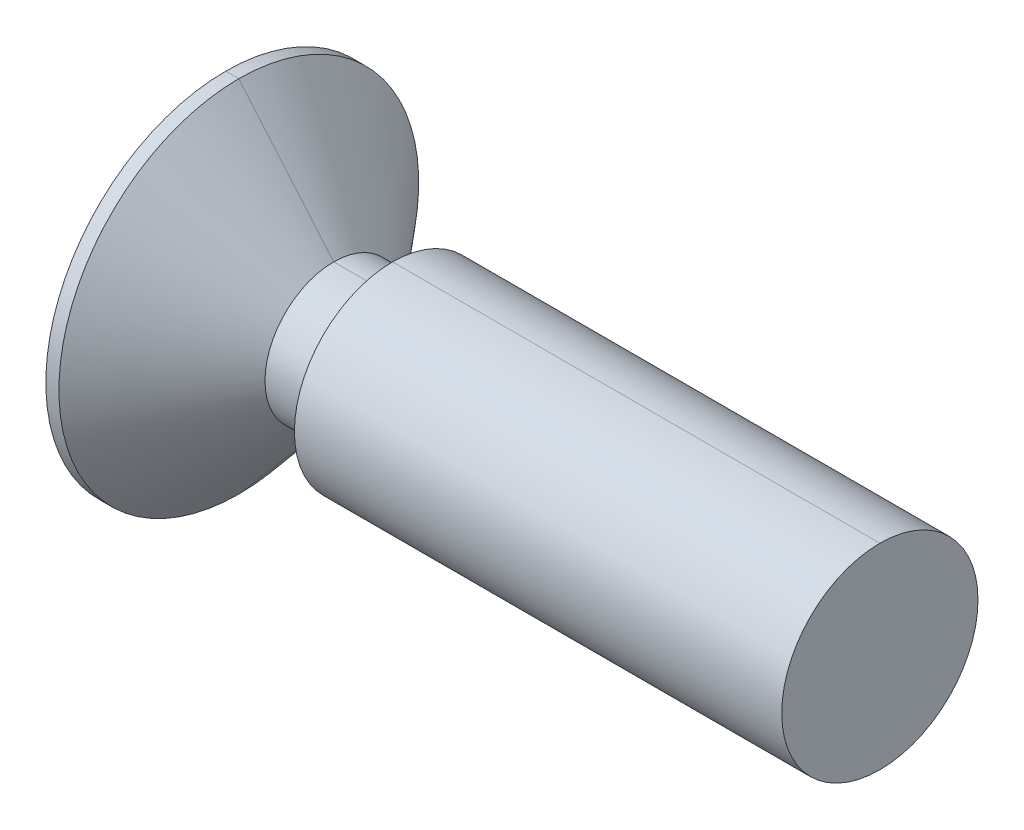
ISO-10303-21;
HEADER;
FILE_DESCRIPTION(('STEP AP214'),'2;1');
FILE_NAME('part.step','',(''),(''),'','','');
FILE_SCHEMA(('AUTOMOTIVE_DESIGN { 1 0 10303 214 1 1 1 1 }'));
ENDSEC;
DATA;
#1=APPLICATION_CONTEXT('core data for automotive mechanical design processes');
#2=APPLICATION_PROTOCOL_DEFINITION('international standard','automotive_design',2000,#1);
#3=PRODUCT_CONTEXT('',#1,'mechanical');
#4=PRODUCT('Part','Part','',(#3));
#5=PRODUCT_RELATED_PRODUCT_CATEGORY('part','',(#4));
#6=PRODUCT_DEFINITION_FORMATION('','',#4);
#7=PRODUCT_DEFINITION_CONTEXT('part definition',#1,'design');
#8=PRODUCT_DEFINITION('design','',#6,#7);
#9=PRODUCT_DEFINITION_SHAPE('','',#8);
#10=(LENGTH_UNIT() NAMED_UNIT(*) SI_UNIT(.MILLI.,.METRE.));
#11=(NAMED_UNIT(*) PLANE_ANGLE_UNIT() SI_UNIT($,.RADIAN.));
#12=(NAMED_UNIT(*) SI_UNIT($,.STERADIAN.) SOLID_ANGLE_UNIT());
#13=UNCERTAINTY_MEASURE_WITH_UNIT(LENGTH_MEASURE(1.E-05),#10,'distance_accuracy_value','');
#14=(GEOMETRIC_REPRESENTATION_CONTEXT(3) GLOBAL_UNCERTAINTY_ASSIGNED_CONTEXT((#13)) GLOBAL_UNIT_ASSIGNED_CONTEXT((#10,
#11,#12)) REPRESENTATION_CONTEXT('',''));
#15=CARTESIAN_POINT('',(0.,0.,0.));
#16=DIRECTION('',(0.,0.,1.));
#17=DIRECTION('',(1.,0.,0.));
#18=AXIS2_PLACEMENT_3D('',#15,#16,#17);
#19=CARTESIAN_POINT('',(-9.175,0.675,-0.675));
#20=DIRECTION('',(1.,0.,0.));
#21=DIRECTION('',(0.,1.,0.));
#22=AXIS2_PLACEMENT_3D('',#19,#20,#21);
#23=PLANE('',#22);
#24=DIRECTION('',(0.,-1.,0.));
#25=VECTOR('',#24,1.);
#26=CARTESIAN_POINT('',(-9.175,1.8,-0.375));
#27=LINE('',#26,#25);
#28=CARTESIAN_POINT('',(-9.175,1.8,-0.375));
#29=VERTEX_POINT('',#28);
#30=CARTESIAN_POINT('',(-9.175,0.675,-0.375));
#31=VERTEX_POINT('',#30);
#32=EDGE_CURVE('E362',#29,#31,#27,.T.);
#33=ORIENTED_EDGE('',*,*,#32,.T.);
#34=CARTESIAN_POINT('',(-9.175,0.675,-0.675));
#35=DIRECTION('',(1.,0.,0.));
#36=DIRECTION('',(0.,1.,0.));
#37=AXIS2_PLACEMENT_3D('',#34,#35,#36);
#38=CIRCLE('',#37,0.3);
#39=CARTESIAN_POINT('',(-9.175,0.375,-0.675));
#40=VERTEX_POINT('',#39);
#41=EDGE_CURVE('E10',#31,#40,#38,.T.);
#42=ORIENTED_EDGE('',*,*,#41,.T.);
#43=DIRECTION('',(0.,0.,-1.));
#44=VECTOR('',#43,1.);
#45=CARTESIAN_POINT('',(-9.175,0.375,-1.8));
#46=LINE('',#45,#44);
#47=CARTESIAN_POINT('',(-9.175,0.375,-1.8));
#48=VERTEX_POINT('',#47);
#49=EDGE_CURVE('E400',#40,#48,#46,.T.);
#50=ORIENTED_EDGE('',*,*,#49,.T.);
#51=DIRECTION('',(0.,-1.,0.));
#52=VECTOR('',#51,1.);
#53=CARTESIAN_POINT('',(-9.175,0.375,-1.8));
#54=LINE('',#53,#52);
#55=CARTESIAN_POINT('',(-9.175,-0.375,-1.8));
#56=VERTEX_POINT('',#55);
#57=EDGE_CURVE('E375',#48,#56,#54,.T.);
#58=ORIENTED_EDGE('',*,*,#57,.T.);
#59=DIRECTION('',(0.,0.,1.));
#60=VECTOR('',#59,1.);
#61=CARTESIAN_POINT('',(-9.175,-0.375,-1.8));
#62=LINE('',#61,#60);
#63=CARTESIAN_POINT('',(-9.175,-0.375,-0.675));
#64=VERTEX_POINT('',#63);
#65=EDGE_CURVE('E328',#56,#64,#62,.T.);
#66=ORIENTED_EDGE('',*,*,#65,.T.);
#67=CARTESIAN_POINT('',(-9.175,-0.675,-0.675));
#68=DIRECTION('',(1.,0.,0.));
#69=DIRECTION('',(0.,-1.,0.));
#70=AXIS2_PLACEMENT_3D('',#67,#68,#69);
#71=CIRCLE('',#70,0.3);
#72=CARTESIAN_POINT('',(-9.175,-0.675,-0.375));
#73=VERTEX_POINT('',#72);
#74=EDGE_CURVE('E301',#64,#73,#71,.T.);
#75=ORIENTED_EDGE('',*,*,#74,.T.);
#76=DIRECTION('',(0.,-1.,0.));
#77=VECTOR('',#76,1.);
#78=CARTESIAN_POINT('',(-9.175,-0.675,-0.375));
#79=LINE('',#78,#77);
#80=CARTESIAN_POINT('',(-9.175,-1.8,-0.375));
#81=VERTEX_POINT('',#80);
#82=EDGE_CURVE('E343',#73,#81,#79,.T.);
#83=ORIENTED_EDGE('',*,*,#82,.T.);
#84=DIRECTION('',(0.,0.,1.));
#85=VECTOR('',#84,1.);
#86=CARTESIAN_POINT('',(-9.175,-1.8,-0.375));
#87=LINE('',#86,#85);
#88=CARTESIAN_POINT('',(-9.175,-1.8,0.375));
#89=VERTEX_POINT('',#88);
#90=EDGE_CURVE('E296',#81,#89,#87,.T.);
#91=ORIENTED_EDGE('',*,*,#90,.T.);
#92=DIRECTION('',(0.,1.,0.));
#93=VECTOR('',#92,1.);
#94=CARTESIAN_POINT('',(-9.175,-0.675,0.375));
#95=LINE('',#94,#93);
#96=CARTESIAN_POINT('',(-9.175,-0.675,0.375));
#97=VERTEX_POINT('',#96);
#98=EDGE_CURVE('E450',#89,#97,#95,.T.);
#99=ORIENTED_EDGE('',*,*,#98,.T.);
#100=CARTESIAN_POINT('',(-9.175,-0.675,0.675));
#101=DIRECTION('',(1.,0.,0.));
#102=DIRECTION('',(0.,1.,0.));
#103=AXIS2_PLACEMENT_3D('',#100,#101,#102);
#104=CIRCLE('',#103,0.3);
#105=CARTESIAN_POINT('',(-9.175,-0.375,0.675));
#106=VERTEX_POINT('',#105);
#107=EDGE_CURVE('E399',#97,#106,#104,.T.);
#108=ORIENTED_EDGE('',*,*,#107,.T.);
#109=DIRECTION('',(0.,0.,1.));
#110=VECTOR('',#109,1.);
#111=CARTESIAN_POINT('',(-9.175,-0.375,0.675));
#112=LINE('',#111,#110);
#113=CARTESIAN_POINT('',(-9.175,-0.375,1.8));
#114=VERTEX_POINT('',#113);
#115=EDGE_CURVE('E323',#106,#114,#112,.T.);
#116=ORIENTED_EDGE('',*,*,#115,.T.);
#117=DIRECTION('',(0.,1.,0.));
#118=VECTOR('',#117,1.);
#119=CARTESIAN_POINT('',(-9.175,0.375,1.8));
#120=LINE('',#119,#118);
#121=CARTESIAN_POINT('',(-9.175,0.375,1.8));
#122=VERTEX_POINT('',#121);
#123=EDGE_CURVE('E324',#114,#122,#120,.T.);
#124=ORIENTED_EDGE('',*,*,#123,.T.);
#125=DIRECTION('',(0.,0.,-1.));
#126=VECTOR('',#125,1.);
#127=CARTESIAN_POINT('',(-9.175,0.375,0.675));
#128=LINE('',#127,#126);
#129=CARTESIAN_POINT('',(-9.175,0.375,0.675));
#130=VERTEX_POINT('',#129);
#131=EDGE_CURVE('E310',#122,#130,#128,.T.);
#132=ORIENTED_EDGE('',*,*,#131,.T.);
#133=CARTESIAN_POINT('',(-9.175,0.675,0.675));
#134=DIRECTION('',(1.,0.,0.));
#135=DIRECTION('',(0.,1.,0.));
#136=AXIS2_PLACEMENT_3D('',#133,#134,#135);
#137=CIRCLE('',#136,0.3);
#138=CARTESIAN_POINT('',(-9.175,0.675,0.375));
#139=VERTEX_POINT('',#138);
#140=EDGE_CURVE('E345',#130,#139,#137,.T.);
#141=ORIENTED_EDGE('',*,*,#140,.T.);
#142=DIRECTION('',(0.,1.,0.));
#143=VECTOR('',#142,1.);
#144=CARTESIAN_POINT('',(-9.175,1.8,0.375));
#145=LINE('',#144,#143);
#146=CARTESIAN_POINT('',(-9.175,1.8,0.375));
#147=VERTEX_POINT('',#146);
#148=EDGE_CURVE('E291',#139,#147,#145,.T.);
#149=ORIENTED_EDGE('',*,*,#148,.T.);
#150=DIRECTION('',(0.,0.,-1.));
#151=VECTOR('',#150,1.);
#152=CARTESIAN_POINT('',(-9.175,1.8,-0.375));
#153=LINE('',#152,#151);
#154=EDGE_CURVE('E390',#147,#29,#153,.T.);
#155=ORIENTED_EDGE('',*,*,#154,.T.);
#156=EDGE_LOOP('',(#33,#42,#50,#58,#66,#75,#83,#91,#99,#108,#116,#124,#132,#141,#149,#155));
#157=FACE_BOUND('',#156,.T.);
#158=ADVANCED_FACE('F16',(#157),#23,.F.);
#159=CARTESIAN_POINT('',(-9.175,0.675,-0.675));
#160=DIRECTION('',(-1.,0.,0.));
#161=DIRECTION('',(0.,-1.,0.));
#162=AXIS2_PLACEMENT_3D('',#159,#160,#161);
#163=CYLINDRICAL_SURFACE('',#162,0.3);
#164=CARTESIAN_POINT('',(-10.,0.675,-0.675));
#165=DIRECTION('',(1.,0.,0.));
#166=DIRECTION('',(0.,1.,0.));
#167=AXIS2_PLACEMENT_3D('',#164,#165,#166);
#168=CIRCLE('',#167,0.3);
#169=CARTESIAN_POINT('',(-10.,0.675,-0.375));
#170=VERTEX_POINT('',#169);
#171=CARTESIAN_POINT('',(-10.,0.375,-0.675));
#172=VERTEX_POINT('',#171);
#173=EDGE_CURVE('E352',#170,#172,#168,.T.);
#174=ORIENTED_EDGE('',*,*,#173,.T.);
#175=DIRECTION('',(-1.,0.,0.));
#176=VECTOR('',#175,1.);
#177=CARTESIAN_POINT('',(-9.175,0.375,-0.675));
#178=LINE('',#177,#176);
#179=EDGE_CURVE('E20',#40,#172,#178,.T.);
#180=ORIENTED_EDGE('',*,*,#179,.F.);
#181=ORIENTED_EDGE('',*,*,#41,.F.);
#182=DIRECTION('',(-1.,0.,0.));
#183=VECTOR('',#182,1.);
#184=CARTESIAN_POINT('',(-9.175,0.675,-0.375));
#185=LINE('',#184,#183);
#186=EDGE_CURVE('E366',#31,#170,#185,.T.);
#187=ORIENTED_EDGE('',*,*,#186,.T.);
#188=EDGE_LOOP('',(#174,#180,#181,#187));
#189=FACE_BOUND('',#188,.T.);
#190=ADVANCED_FACE('F634',(#189),#163,.T.);
#191=CARTESIAN_POINT('',(-9.175,0.375,-1.8));
#192=DIRECTION('',(0.,1.,0.));
#193=DIRECTION('',(1.,0.,0.));
#194=AXIS2_PLACEMENT_3D('',#191,#192,#193);
#195=PLANE('',#194);
#196=DIRECTION('',(0.,0.,-1.));
#197=VECTOR('',#196,1.);
#198=CARTESIAN_POINT('',(-10.,0.375,-1.8));
#199=LINE('',#198,#197);
#200=CARTESIAN_POINT('',(-10.,0.375,-1.8));
#201=VERTEX_POINT('',#200);
#202=EDGE_CURVE('E348',#172,#201,#199,.T.);
#203=ORIENTED_EDGE('',*,*,#202,.T.);
#204=DIRECTION('',(-1.,0.,0.));
#205=VECTOR('',#204,1.);
#206=CARTESIAN_POINT('',(-9.175,0.375,-1.8));
#207=LINE('',#206,#205);
#208=EDGE_CURVE('E285',#48,#201,#207,.T.);
#209=ORIENTED_EDGE('',*,*,#208,.F.);
#210=ORIENTED_EDGE('',*,*,#49,.F.);
#211=ORIENTED_EDGE('',*,*,#179,.T.);
#212=EDGE_LOOP('',(#203,#209,#210,#211));
#213=FACE_BOUND('',#212,.T.);
#214=ADVANCED_FACE('F522',(#213),#195,.F.);
#215=CARTESIAN_POINT('',(-9.175,0.375,-1.8));
#216=DIRECTION('',(0.,0.,-1.));
#217=DIRECTION('',(0.,-1.,0.));
#218=AXIS2_PLACEMENT_3D('',#215,#216,#217);
#219=PLANE('',#218);
#220=DIRECTION('',(0.,-1.,0.));
#221=VECTOR('',#220,1.);
#222=CARTESIAN_POINT('',(-10.,0.375,-1.8));
#223=LINE('',#222,#221);
#224=CARTESIAN_POINT('',(-10.,-0.375,-1.8));
#225=VERTEX_POINT('',#224);
#226=EDGE_CURVE('E338',#201,#225,#223,.T.);
#227=ORIENTED_EDGE('',*,*,#226,.T.);
#228=DIRECTION('',(-1.,0.,0.));
#229=VECTOR('',#228,1.);
#230=CARTESIAN_POINT('',(-9.175,-0.375,-1.8));
#231=LINE('',#230,#229);
#232=EDGE_CURVE('E331',#56,#225,#231,.T.);
#233=ORIENTED_EDGE('',*,*,#232,.F.);
#234=ORIENTED_EDGE('',*,*,#57,.F.);
#235=ORIENTED_EDGE('',*,*,#208,.T.);
#236=EDGE_LOOP('',(#227,#233,#234,#235));
#237=FACE_BOUND('',#236,.T.);
#238=ADVANCED_FACE('F470',(#237),#219,.F.);
#239=CARTESIAN_POINT('',(-9.175,-0.375,-1.8));
#240=DIRECTION('',(0.,-1.,0.));
#241=DIRECTION('',(0.,0.,-1.));
#242=AXIS2_PLACEMENT_3D('',#239,#240,#241);
#243=PLANE('',#242);
#244=DIRECTION('',(0.,0.,1.));
#245=VECTOR('',#244,1.);
#246=CARTESIAN_POINT('',(-10.,-0.375,-1.8));
#247=LINE('',#246,#245);
#248=CARTESIAN_POINT('',(-10.,-0.375,-0.675));
#249=VERTEX_POINT('',#248);
#250=EDGE_CURVE('E334',#225,#249,#247,.T.);
#251=ORIENTED_EDGE('',*,*,#250,.T.);
#252=DIRECTION('',(-1.,0.,0.));
#253=VECTOR('',#252,1.);
#254=CARTESIAN_POINT('',(-9.175,-0.375,-0.675));
#255=LINE('',#254,#253);
#256=EDGE_CURVE('E304',#64,#249,#255,.T.);
#257=ORIENTED_EDGE('',*,*,#256,.F.);
#258=ORIENTED_EDGE('',*,*,#65,.F.);
#259=ORIENTED_EDGE('',*,*,#232,.T.);
#260=EDGE_LOOP('',(#251,#257,#258,#259));
#261=FACE_BOUND('',#260,.T.);
#262=ADVANCED_FACE('F18',(#261),#243,.F.);
#263=CARTESIAN_POINT('',(-9.175,-0.675,-0.675));
#264=DIRECTION('',(-1.,0.,0.));
#265=DIRECTION('',(0.,-1.,0.));
#266=AXIS2_PLACEMENT_3D('',#263,#264,#265);
#267=CYLINDRICAL_SURFACE('',#266,0.3);
#268=CARTESIAN_POINT('',(-10.,-0.675,-0.675));
#269=DIRECTION('',(1.,0.,0.));
#270=DIRECTION('',(0.,-1.,0.));
#271=AXIS2_PLACEMENT_3D('',#268,#269,#270);
#272=CIRCLE('',#271,0.3);
#273=CARTESIAN_POINT('',(-10.,-0.675,-0.375));
#274=VERTEX_POINT('',#273);
#275=EDGE_CURVE('E339',#249,#274,#272,.T.);
#276=ORIENTED_EDGE('',*,*,#275,.T.);
#277=DIRECTION('',(-1.,0.,0.));
#278=VECTOR('',#277,1.);
#279=CARTESIAN_POINT('',(-9.175,-0.675,-0.375));
#280=LINE('',#279,#278);
#281=EDGE_CURVE('E305',#73,#274,#280,.T.);
#282=ORIENTED_EDGE('',*,*,#281,.F.);
#283=ORIENTED_EDGE('',*,*,#74,.F.);
#284=ORIENTED_EDGE('',*,*,#256,.T.);
#285=EDGE_LOOP('',(#276,#282,#283,#284));
#286=FACE_BOUND('',#285,.T.);
#287=ADVANCED_FACE('F511',(#286),#267,.T.);
#288=CARTESIAN_POINT('',(-9.175,-0.675,-0.375));
#289=DIRECTION('',(0.,0.,-1.));
#290=DIRECTION('',(0.,-1.,0.));
#291=AXIS2_PLACEMENT_3D('',#288,#289,#290);
#292=PLANE('',#291);
#293=DIRECTION('',(0.,-1.,0.));
#294=VECTOR('',#293,1.);
#295=CARTESIAN_POINT('',(-10.,-0.675,-0.375));
#296=LINE('',#295,#294);
#297=CARTESIAN_POINT('',(-10.,-1.8,-0.375));
#298=VERTEX_POINT('',#297);
#299=EDGE_CURVE('E288',#274,#298,#296,.T.);
#300=ORIENTED_EDGE('',*,*,#299,.T.);
#301=DIRECTION('',(-1.,0.,0.));
#302=VECTOR('',#301,1.);
#303=CARTESIAN_POINT('',(-9.175,-1.8,-0.375));
#304=LINE('',#303,#302);
#305=EDGE_CURVE('E299',#81,#298,#304,.T.);
#306=ORIENTED_EDGE('',*,*,#305,.F.);
#307=ORIENTED_EDGE('',*,*,#82,.F.);
#308=ORIENTED_EDGE('',*,*,#281,.T.);
#309=EDGE_LOOP('',(#300,#306,#307,#308));
#310=FACE_BOUND('',#309,.T.);
#311=ADVANCED_FACE('F517',(#310),#292,.F.);
#312=CARTESIAN_POINT('',(-9.175,-1.8,-0.375));
#313=DIRECTION('',(0.,-1.,0.));
#314=DIRECTION('',(0.,0.,-1.));
#315=AXIS2_PLACEMENT_3D('',#312,#313,#314);
#316=PLANE('',#315);
#317=DIRECTION('',(0.,0.,1.));
#318=VECTOR('',#317,1.);
#319=CARTESIAN_POINT('',(-10.,-1.8,-0.375));
#320=LINE('',#319,#318);
#321=CARTESIAN_POINT('',(-10.,-1.8,0.375));
#322=VERTEX_POINT('',#321);
#323=EDGE_CURVE('E286',#298,#322,#320,.T.);
#324=ORIENTED_EDGE('',*,*,#323,.T.);
#325=DIRECTION('',(-1.,0.,0.));
#326=VECTOR('',#325,1.);
#327=CARTESIAN_POINT('',(-9.175,-1.8,0.375));
#328=LINE('',#327,#326);
#329=EDGE_CURVE('E300',#89,#322,#328,.T.);
#330=ORIENTED_EDGE('',*,*,#329,.F.);
#331=ORIENTED_EDGE('',*,*,#90,.F.);
#332=ORIENTED_EDGE('',*,*,#305,.T.);
#333=EDGE_LOOP('',(#324,#330,#331,#332));
#334=FACE_BOUND('',#333,.T.);
#335=ADVANCED_FACE('F670',(#334),#316,.F.);
#336=CARTESIAN_POINT('',(-9.175,-0.675,0.375));
#337=DIRECTION('',(0.,0.,1.));
#338=DIRECTION('',(0.,-1.,0.));
#339=AXIS2_PLACEMENT_3D('',#336,#337,#338);
#340=PLANE('',#339);
#341=DIRECTION('',(0.,1.,0.));
#342=VECTOR('',#341,1.);
#343=CARTESIAN_POINT('',(-10.,-0.675,0.375));
#344=LINE('',#343,#342);
#345=CARTESIAN_POINT('',(-10.,-0.675,0.375));
#346=VERTEX_POINT('',#345);
#347=EDGE_CURVE('E289',#322,#346,#344,.T.);
#348=ORIENTED_EDGE('',*,*,#347,.T.);
#349=DIRECTION('',(-1.,0.,0.));
#350=VECTOR('',#349,1.);
#351=CARTESIAN_POINT('',(-9.175,-0.675,0.375));
#352=LINE('',#351,#350);
#353=EDGE_CURVE('E453',#97,#346,#352,.T.);
#354=ORIENTED_EDGE('',*,*,#353,.F.);
#355=ORIENTED_EDGE('',*,*,#98,.F.);
#356=ORIENTED_EDGE('',*,*,#329,.T.);
#357=EDGE_LOOP('',(#348,#354,#355,#356));
#358=FACE_BOUND('',#357,.T.);
#359=ADVANCED_FACE('F667',(#358),#340,.F.);
#360=CARTESIAN_POINT('',(-9.175,-0.675,0.675));
#361=DIRECTION('',(-1.,0.,0.));
#362=DIRECTION('',(0.,-1.,0.));
#363=AXIS2_PLACEMENT_3D('',#360,#361,#362);
#364=CYLINDRICAL_SURFACE('',#363,0.3);
#365=CARTESIAN_POINT('',(-10.,-0.675,0.675));
#366=DIRECTION('',(1.,0.,0.));
#367=DIRECTION('',(0.,1.,0.));
#368=AXIS2_PLACEMENT_3D('',#365,#366,#367);
#369=CIRCLE('',#368,0.3);
#370=CARTESIAN_POINT('',(-10.,-0.375,0.675));
#371=VERTEX_POINT('',#370);
#372=EDGE_CURVE('E306',#346,#371,#369,.T.);
#373=ORIENTED_EDGE('',*,*,#372,.T.);
#374=DIRECTION('',(-1.,0.,0.));
#375=VECTOR('',#374,1.);
#376=CARTESIAN_POINT('',(-9.175,-0.375,0.675));
#377=LINE('',#376,#375);
#378=EDGE_CURVE('E146',#106,#371,#377,.T.);
#379=ORIENTED_EDGE('',*,*,#378,.F.);
#380=ORIENTED_EDGE('',*,*,#107,.F.);
#381=ORIENTED_EDGE('',*,*,#353,.T.);
#382=EDGE_LOOP('',(#373,#379,#380,#381));
#383=FACE_BOUND('',#382,.T.);
#384=ADVANCED_FACE('F629',(#383),#364,.T.);
#385=CARTESIAN_POINT('',(-9.175,-0.375,0.675));
#386=DIRECTION('',(0.,-1.,0.));
#387=DIRECTION('',(0.,0.,-1.));
#388=AXIS2_PLACEMENT_3D('',#385,#386,#387);
#389=PLANE('',#388);
#390=DIRECTION('',(0.,0.,1.));
#391=VECTOR('',#390,1.);
#392=CARTESIAN_POINT('',(-10.,-0.375,0.675));
#393=LINE('',#392,#391);
#394=CARTESIAN_POINT('',(-10.,-0.375,1.8));
#395=VERTEX_POINT('',#394);
#396=EDGE_CURVE('E309',#371,#395,#393,.T.);
#397=ORIENTED_EDGE('',*,*,#396,.T.);
#398=DIRECTION('',(-1.,0.,0.));
#399=VECTOR('',#398,1.);
#400=CARTESIAN_POINT('',(-9.175,-0.375,1.8));
#401=LINE('',#400,#399);
#402=EDGE_CURVE('E159',#114,#395,#401,.T.);
#403=ORIENTED_EDGE('',*,*,#402,.F.);
#404=ORIENTED_EDGE('',*,*,#115,.F.);
#405=ORIENTED_EDGE('',*,*,#378,.T.);
#406=EDGE_LOOP('',(#397,#403,#404,#405));
#407=FACE_BOUND('',#406,.T.);
#408=ADVANCED_FACE('F621',(#407),#389,.F.);
#409=CARTESIAN_POINT('',(-9.175,0.375,1.8));
#410=DIRECTION('',(0.,0.,1.));
#411=DIRECTION('',(1.,0.,0.));
#412=AXIS2_PLACEMENT_3D('',#409,#410,#411);
#413=PLANE('',#412);
#414=DIRECTION('',(0.,1.,0.));
#415=VECTOR('',#414,1.);
#416=CARTESIAN_POINT('',(-10.,0.375,1.8));
#417=LINE('',#416,#415);
#418=CARTESIAN_POINT('',(-10.,0.375,1.8));
#419=VERTEX_POINT('',#418);
#420=EDGE_CURVE('E383',#395,#419,#417,.T.);
#421=ORIENTED_EDGE('',*,*,#420,.T.);
#422=DIRECTION('',(-1.,0.,0.));
#423=VECTOR('',#422,1.);
#424=CARTESIAN_POINT('',(-9.175,0.375,1.8));
#425=LINE('',#424,#423);
#426=EDGE_CURVE('E313',#122,#419,#425,.T.);
#427=ORIENTED_EDGE('',*,*,#426,.F.);
#428=ORIENTED_EDGE('',*,*,#123,.F.);
#429=ORIENTED_EDGE('',*,*,#402,.T.);
#430=EDGE_LOOP('',(#421,#427,#428,#429));
#431=FACE_BOUND('',#430,.T.);
#432=ADVANCED_FACE('F619',(#431),#413,.F.);
#433=CARTESIAN_POINT('',(-9.175,0.375,0.675));
#434=DIRECTION('',(0.,1.,0.));
#435=DIRECTION('',(0.,0.,-1.));
#436=AXIS2_PLACEMENT_3D('',#433,#434,#435);
#437=PLANE('',#436);
#438=DIRECTION('',(0.,0.,-1.));
#439=VECTOR('',#438,1.);
#440=CARTESIAN_POINT('',(-10.,0.375,0.675));
#441=LINE('',#440,#439);
#442=CARTESIAN_POINT('',(-10.,0.375,0.675));
#443=VERTEX_POINT('',#442);
#444=EDGE_CURVE('E373',#419,#443,#441,.T.);
#445=ORIENTED_EDGE('',*,*,#444,.T.);
#446=DIRECTION('',(-1.,0.,0.));
#447=VECTOR('',#446,1.);
#448=CARTESIAN_POINT('',(-9.175,0.375,0.675));
#449=LINE('',#448,#447);
#450=EDGE_CURVE('E314',#130,#443,#449,.T.);
#451=ORIENTED_EDGE('',*,*,#450,.F.);
#452=ORIENTED_EDGE('',*,*,#131,.F.);
#453=ORIENTED_EDGE('',*,*,#426,.T.);
#454=EDGE_LOOP('',(#445,#451,#452,#453));
#455=FACE_BOUND('',#454,.T.);
#456=ADVANCED_FACE('F617',(#455),#437,.F.);
#457=CARTESIAN_POINT('',(-9.175,0.675,0.675));
#458=DIRECTION('',(-1.,0.,0.));
#459=DIRECTION('',(0.,-1.,0.));
#460=AXIS2_PLACEMENT_3D('',#457,#458,#459);
#461=CYLINDRICAL_SURFACE('',#460,0.3);
#462=CARTESIAN_POINT('',(-10.,0.675,0.675));
#463=DIRECTION('',(1.,0.,0.));
#464=DIRECTION('',(0.,1.,0.));
#465=AXIS2_PLACEMENT_3D('',#462,#463,#464);
#466=CIRCLE('',#465,0.3);
#467=CARTESIAN_POINT('',(-10.,0.675,0.375));
#468=VERTEX_POINT('',#467);
#469=EDGE_CURVE('E369',#443,#468,#466,.T.);
#470=ORIENTED_EDGE('',*,*,#469,.T.);
#471=DIRECTION('',(-1.,0.,0.));
#472=VECTOR('',#471,1.);
#473=CARTESIAN_POINT('',(-9.175,0.675,0.375));
#474=LINE('',#473,#472);
#475=EDGE_CURVE('E294',#139,#468,#474,.T.);
#476=ORIENTED_EDGE('',*,*,#475,.F.);
#477=ORIENTED_EDGE('',*,*,#140,.F.);
#478=ORIENTED_EDGE('',*,*,#450,.T.);
#479=EDGE_LOOP('',(#470,#476,#477,#478));
#480=FACE_BOUND('',#479,.T.);
#481=ADVANCED_FACE('F612',(#480),#461,.T.);
#482=CARTESIAN_POINT('',(-9.175,1.8,0.375));
#483=DIRECTION('',(0.,0.,1.));
#484=DIRECTION('',(0.,-1.,0.));
#485=AXIS2_PLACEMENT_3D('',#482,#483,#484);
#486=PLANE('',#485);
#487=DIRECTION('',(0.,1.,0.));
#488=VECTOR('',#487,1.);
#489=CARTESIAN_POINT('',(-10.,1.8,0.375));
#490=LINE('',#489,#488);
#491=CARTESIAN_POINT('',(-10.,1.8,0.375));
#492=VERTEX_POINT('',#491);
#493=EDGE_CURVE('E374',#468,#492,#490,.T.);
#494=ORIENTED_EDGE('',*,*,#493,.T.);
#495=DIRECTION('',(-1.,0.,0.));
#496=VECTOR('',#495,1.);
#497=CARTESIAN_POINT('',(-9.175,1.8,0.375));
#498=LINE('',#497,#496);
#499=EDGE_CURVE('E295',#147,#492,#498,.T.);
#500=ORIENTED_EDGE('',*,*,#499,.F.);
#501=ORIENTED_EDGE('',*,*,#148,.F.);
#502=ORIENTED_EDGE('',*,*,#475,.T.);
#503=EDGE_LOOP('',(#494,#500,#501,#502));
#504=FACE_BOUND('',#503,.T.);
#505=ADVANCED_FACE('F598',(#504),#486,.F.);
#506=CARTESIAN_POINT('',(-9.175,1.8,-0.375));
#507=DIRECTION('',(0.,1.,0.));
#508=DIRECTION('',(0.,0.,-1.));
#509=AXIS2_PLACEMENT_3D('',#506,#507,#508);
#510=PLANE('',#509);
#511=DIRECTION('',(0.,0.,-1.));
#512=VECTOR('',#511,1.);
#513=CARTESIAN_POINT('',(-10.,1.8,-0.375));
#514=LINE('',#513,#512);
#515=CARTESIAN_POINT('',(-10.,1.8,-0.375));
#516=VERTEX_POINT('',#515);
#517=EDGE_CURVE('E403',#492,#516,#514,.T.);
#518=ORIENTED_EDGE('',*,*,#517,.T.);
#519=DIRECTION('',(-1.,0.,0.));
#520=VECTOR('',#519,1.);
#521=CARTESIAN_POINT('',(-9.175,1.8,-0.375));
#522=LINE('',#521,#520);
#523=EDGE_CURVE('E365',#29,#516,#522,.T.);
#524=ORIENTED_EDGE('',*,*,#523,.F.);
#525=ORIENTED_EDGE('',*,*,#154,.F.);
#526=ORIENTED_EDGE('',*,*,#499,.T.);
#527=EDGE_LOOP('',(#518,#524,#525,#526));
#528=FACE_BOUND('',#527,.T.);
#529=ADVANCED_FACE('F606',(#528),#510,.F.);
#530=CARTESIAN_POINT('',(-9.175,1.8,-0.375));
#531=DIRECTION('',(0.,0.,-1.));
#532=DIRECTION('',(0.,-1.,0.));
#533=AXIS2_PLACEMENT_3D('',#530,#531,#532);
#534=PLANE('',#533);
#535=DIRECTION('',(0.,-1.,0.));
#536=VECTOR('',#535,1.);
#537=CARTESIAN_POINT('',(-10.,1.8,-0.375));
#538=LINE('',#537,#536);
#539=EDGE_CURVE('E407',#516,#170,#538,.T.);
#540=ORIENTED_EDGE('',*,*,#539,.T.);
#541=ORIENTED_EDGE('',*,*,#186,.F.);
#542=ORIENTED_EDGE('',*,*,#32,.F.);
#543=ORIENTED_EDGE('',*,*,#523,.T.);
#544=EDGE_LOOP('',(#540,#541,#542,#543));
#545=FACE_BOUND('',#544,.T.);
#546=ADVANCED_FACE('F666',(#545),#534,.F.);
#547=CARTESIAN_POINT('',(-10.,2.75,0.));
#548=DIRECTION('',(-1.,0.,0.));
#549=DIRECTION('',(0.,1.,0.));
#550=AXIS2_PLACEMENT_3D('',#547,#548,#549);
#551=PLANE('',#550);
#552=ORIENTED_EDGE('',*,*,#539,.F.);
#553=ORIENTED_EDGE('',*,*,#517,.F.);
#554=ORIENTED_EDGE('',*,*,#493,.F.);
#555=ORIENTED_EDGE('',*,*,#469,.F.);
#556=ORIENTED_EDGE('',*,*,#444,.F.);
#557=ORIENTED_EDGE('',*,*,#420,.F.);
#558=ORIENTED_EDGE('',*,*,#396,.F.);
#559=ORIENTED_EDGE('',*,*,#372,.F.);
#560=ORIENTED_EDGE('',*,*,#347,.F.);
#561=ORIENTED_EDGE('',*,*,#323,.F.);
#562=ORIENTED_EDGE('',*,*,#299,.F.);
#563=ORIENTED_EDGE('',*,*,#275,.F.);
#564=ORIENTED_EDGE('',*,*,#250,.F.);
#565=ORIENTED_EDGE('',*,*,#226,.F.);
#566=ORIENTED_EDGE('',*,*,#202,.F.);
#567=ORIENTED_EDGE('',*,*,#173,.F.);
#568=EDGE_LOOP('',(#552,#553,#554,#555,#556,#557,#558,#559,#560,#561,#562,#563,#564,#565,#566,#567));
#569=FACE_BOUND('',#568,.T.);
#570=CARTESIAN_POINT('',(-10.,0.,0.));
#571=DIRECTION('',(1.,0.,0.));
#572=DIRECTION('',(0.,1.,0.));
#573=AXIS2_PLACEMENT_3D('',#570,#571,#572);
#574=CIRCLE('',#573,2.75);
#575=CARTESIAN_POINT('',(-10.,2.75,0.));
#576=VERTEX_POINT('',#575);
#577=CARTESIAN_POINT('',(-10.,-2.75,0.));
#578=VERTEX_POINT('',#577);
#579=EDGE_CURVE('E281',#576,#578,#574,.T.);
#580=ORIENTED_EDGE('',*,*,#579,.F.);
#581=CARTESIAN_POINT('',(-10.,0.,0.));
#582=DIRECTION('',(1.,0.,0.));
#583=DIRECTION('',(0.,1.,0.));
#584=AXIS2_PLACEMENT_3D('',#581,#582,#583);
#585=CIRCLE('',#584,2.75);
#586=EDGE_CURVE('E253',#578,#576,#585,.T.);
#587=ORIENTED_EDGE('',*,*,#586,.F.);
#588=EDGE_LOOP('',(#580,#587));
#589=FACE_BOUND('',#588,.T.);
#590=ADVANCED_FACE('F477',(#569,#589),#551,.T.);
#591=CARTESIAN_POINT('',(0.,0.,0.));
#592=DIRECTION('',(1.,0.,0.));
#593=DIRECTION('',(0.,1.,0.));
#594=AXIS2_PLACEMENT_3D('',#591,#592,#593);
#595=CYLINDRICAL_SURFACE('',#594,2.75);
#596=DIRECTION('',(1.,0.,0.));
#597=VECTOR('',#596,1.);
#598=CARTESIAN_POINT('',(0.,-2.75,0.));
#599=LINE('',#598,#597);
#600=CARTESIAN_POINT('',(-9.8,-2.75,0.));
#601=VERTEX_POINT('',#600);
#602=EDGE_CURVE('E273',#578,#601,#599,.T.);
#603=ORIENTED_EDGE('',*,*,#602,.F.);
#604=ORIENTED_EDGE('',*,*,#586,.T.);
#605=DIRECTION('',(1.,0.,0.));
#606=VECTOR('',#605,1.);
#607=CARTESIAN_POINT('',(0.,2.75,0.));
#608=LINE('',#607,#606);
#609=CARTESIAN_POINT('',(-9.8,2.75,0.));
#610=VERTEX_POINT('',#609);
#611=EDGE_CURVE('E265',#576,#610,#608,.T.);
#612=ORIENTED_EDGE('',*,*,#611,.T.);
#613=CARTESIAN_POINT('',(-9.8,0.,0.));
#614=DIRECTION('',(1.,0.,0.));
#615=DIRECTION('',(0.,1.,0.));
#616=AXIS2_PLACEMENT_3D('',#613,#614,#615);
#617=CIRCLE('',#616,2.75);
#618=EDGE_CURVE('E241',#601,#610,#617,.T.);
#619=ORIENTED_EDGE('',*,*,#618,.F.);
#620=EDGE_LOOP('',(#603,#604,#612,#619));
#621=FACE_BOUND('',#620,.T.);
#622=ADVANCED_FACE('F266',(#621),#595,.T.);
#623=CARTESIAN_POINT('',(-8.35,0.,0.));
#624=DIRECTION('',(-1.,0.,0.));
#625=DIRECTION('',(0.,-1.,0.));
#626=AXIS2_PLACEMENT_3D('',#623,#624,#625);
#627=CONICAL_SURFACE('',#626,1.05,0.8645972343669);
#628=DIRECTION('',(-0.64894660608275,0.760833951959086,0.));
#629=VECTOR('',#628,1.);
#630=CARTESIAN_POINT('',(-8.35,1.05,0.));
#631=LINE('',#630,#629);
#632=CARTESIAN_POINT('',(-8.35,1.05,0.));
#633=VERTEX_POINT('',#632);
#634=EDGE_CURVE('E247',#633,#610,#631,.T.);
#635=ORIENTED_EDGE('',*,*,#634,.F.);
#636=CARTESIAN_POINT('',(-8.35,0.,0.));
#637=DIRECTION('',(1.,0.,0.));
#638=DIRECTION('',(0.,1.,0.));
#639=AXIS2_PLACEMENT_3D('',#636,#637,#638);
#640=CIRCLE('',#639,1.05);
#641=CARTESIAN_POINT('',(-8.35,-1.05,0.));
#642=VERTEX_POINT('',#641);
#643=EDGE_CURVE('E197',#642,#633,#640,.T.);
#644=ORIENTED_EDGE('',*,*,#643,.F.);
#645=DIRECTION('',(-0.64894660608275,-0.760833951959086,0.));
#646=VECTOR('',#645,1.);
#647=CARTESIAN_POINT('',(-8.35,-1.05,0.));
#648=LINE('',#647,#646);
#649=EDGE_CURVE('E250',#642,#601,#648,.T.);
#650=ORIENTED_EDGE('',*,*,#649,.T.);
#651=ORIENTED_EDGE('',*,*,#618,.T.);
#652=EDGE_LOOP('',(#635,#644,#650,#651));
#653=FACE_BOUND('',#652,.T.);
#654=ADVANCED_FACE('F246',(#653),#627,.T.);
#655=CARTESIAN_POINT('',(0.,0.,0.));
#656=DIRECTION('',(1.,0.,0.));
#657=DIRECTION('',(0.,1.,0.));
#658=AXIS2_PLACEMENT_3D('',#655,#656,#657);
#659=CYLINDRICAL_SURFACE('',#658,1.05);
#660=DIRECTION('',(1.,0.,0.));
#661=VECTOR('',#660,1.);
#662=CARTESIAN_POINT('',(0.,-1.05,0.));
#663=LINE('',#662,#661);
#664=CARTESIAN_POINT('',(-7.45,-1.05,0.));
#665=VERTEX_POINT('',#664);
#666=EDGE_CURVE('E355',#642,#665,#663,.T.);
#667=ORIENTED_EDGE('',*,*,#666,.F.);
#668=ORIENTED_EDGE('',*,*,#643,.T.);
#669=DIRECTION('',(1.,0.,0.));
#670=VECTOR('',#669,1.);
#671=CARTESIAN_POINT('',(0.,1.05,0.));
#672=LINE('',#671,#670);
#673=CARTESIAN_POINT('',(-7.45,1.05,0.));
#674=VERTEX_POINT('',#673);
#675=EDGE_CURVE('E408',#633,#674,#672,.T.);
#676=ORIENTED_EDGE('',*,*,#675,.T.);
#677=CARTESIAN_POINT('',(-7.45,0.,0.));
#678=DIRECTION('',(1.,0.,0.));
#679=DIRECTION('',(0.,1.,0.));
#680=AXIS2_PLACEMENT_3D('',#677,#678,#679);
#681=CIRCLE('',#680,1.05);
#682=EDGE_CURVE('E183',#665,#674,#681,.T.);
#683=ORIENTED_EDGE('',*,*,#682,.F.);
#684=EDGE_LOOP('',(#667,#668,#676,#683));
#685=FACE_BOUND('',#684,.T.);
#686=ADVANCED_FACE('F659',(#685),#659,.T.);
#687=CARTESIAN_POINT('',(-7.45,1.5,0.));
#688=DIRECTION('',(-1.,0.,0.));
#689=DIRECTION('',(0.,1.,0.));
#690=AXIS2_PLACEMENT_3D('',#687,#688,#689);
#691=PLANE('',#690);
#692=CARTESIAN_POINT('',(-7.45,0.,0.));
#693=DIRECTION('',(1.,0.,0.));
#694=DIRECTION('',(0.,1.,0.));
#695=AXIS2_PLACEMENT_3D('',#692,#693,#694);
#696=CIRCLE('',#695,1.05);
#697=EDGE_CURVE('E359',#674,#665,#696,.T.);
#698=ORIENTED_EDGE('',*,*,#697,.T.);
#699=ORIENTED_EDGE('',*,*,#682,.T.);
#700=EDGE_LOOP('',(#698,#699));
#701=FACE_BOUND('',#700,.T.);
#702=CARTESIAN_POINT('',(-7.45,0.,0.));
#703=DIRECTION('',(1.,0.,0.));
#704=DIRECTION('',(0.,1.,0.));
#705=AXIS2_PLACEMENT_3D('',#702,#703,#704);
#706=CIRCLE('',#705,1.5);
#707=CARTESIAN_POINT('',(-7.45,1.5,0.));
#708=VERTEX_POINT('',#707);
#709=CARTESIAN_POINT('',(-7.45,-1.5,0.));
#710=VERTEX_POINT('',#709);
#711=EDGE_CURVE('E411',#708,#710,#706,.T.);
#712=ORIENTED_EDGE('',*,*,#711,.F.);
#713=CARTESIAN_POINT('',(-7.45,0.,0.));
#714=DIRECTION('',(1.,0.,0.));
#715=DIRECTION('',(0.,1.,0.));
#716=AXIS2_PLACEMENT_3D('',#713,#714,#715);
#717=CIRCLE('',#716,1.5);
#718=EDGE_CURVE('E325',#710,#708,#717,.T.);
#719=ORIENTED_EDGE('',*,*,#718,.F.);
#720=EDGE_LOOP('',(#712,#719));
#721=FACE_BOUND('',#720,.T.);
#722=ADVANCED_FACE('F650',(#701,#721),#691,.T.);
#723=CARTESIAN_POINT('',(0.,0.,0.));
#724=DIRECTION('',(1.,0.,0.));
#725=DIRECTION('',(0.,1.,0.));
#726=AXIS2_PLACEMENT_3D('',#723,#724,#725);
#727=CYLINDRICAL_SURFACE('',#726,1.5);
#728=DIRECTION('',(1.,0.,0.));
#729=VECTOR('',#728,1.);
#730=CARTESIAN_POINT('',(0.,-1.5,0.));
#731=LINE('',#730,#729);
#732=CARTESIAN_POINT('',(0.,-1.5,0.));
#733=VERTEX_POINT('',#732);
#734=EDGE_CURVE('E415',#710,#733,#731,.T.);
#735=ORIENTED_EDGE('',*,*,#734,.F.);
#736=ORIENTED_EDGE('',*,*,#718,.T.);
#737=DIRECTION('',(1.,0.,0.));
#738=VECTOR('',#737,1.);
#739=CARTESIAN_POINT('',(0.,1.5,0.));
#740=LINE('',#739,#738);
#741=CARTESIAN_POINT('',(0.,1.5,0.));
#742=VERTEX_POINT('',#741);
#743=EDGE_CURVE('E315',#708,#742,#740,.T.);
#744=ORIENTED_EDGE('',*,*,#743,.T.);
#745=CARTESIAN_POINT('',(0.,0.,0.));
#746=DIRECTION('',(1.,0.,0.));
#747=DIRECTION('',(0.,1.,0.));
#748=AXIS2_PLACEMENT_3D('',#745,#746,#747);
#749=CIRCLE('',#748,1.5);
#750=EDGE_CURVE('E319',#733,#742,#749,.T.);
#751=ORIENTED_EDGE('',*,*,#750,.F.);
#752=EDGE_LOOP('',(#735,#736,#744,#751));
#753=FACE_BOUND('',#752,.T.);
#754=ADVANCED_FACE('F647',(#753),#727,.T.);
#755=CARTESIAN_POINT('',(0.,0.,0.));
#756=DIRECTION('',(1.,0.,0.));
#757=DIRECTION('',(0.,1.,0.));
#758=AXIS2_PLACEMENT_3D('',#755,#756,#757);
#759=PLANE('',#758);
#760=CARTESIAN_POINT('',(0.,0.,0.));
#761=DIRECTION('',(1.,0.,0.));
#762=DIRECTION('',(0.,1.,0.));
#763=AXIS2_PLACEMENT_3D('',#760,#761,#762);
#764=CIRCLE('',#763,1.5);
#765=EDGE_CURVE('E320',#742,#733,#764,.T.);
#766=ORIENTED_EDGE('',*,*,#765,.T.);
#767=ORIENTED_EDGE('',*,*,#750,.T.);
#768=EDGE_LOOP('',(#766,#767));
#769=FACE_BOUND('',#768,.T.);
#770=ADVANCED_FACE('F643',(#769),#759,.T.);
#771=CARTESIAN_POINT('',(0.,0.,0.));
#772=DIRECTION('',(1.,0.,0.));
#773=DIRECTION('',(0.,1.,0.));
#774=AXIS2_PLACEMENT_3D('',#771,#772,#773);
#775=CYLINDRICAL_SURFACE('',#774,1.5);
#776=ORIENTED_EDGE('',*,*,#711,.T.);
#777=ORIENTED_EDGE('',*,*,#734,.T.);
#778=ORIENTED_EDGE('',*,*,#765,.F.);
#779=ORIENTED_EDGE('',*,*,#743,.F.);
#780=EDGE_LOOP('',(#776,#777,#778,#779));
#781=FACE_BOUND('',#780,.T.);
#782=ADVANCED_FACE('F655',(#781),#775,.T.);
#783=CARTESIAN_POINT('',(0.,0.,0.));
#784=DIRECTION('',(1.,0.,0.));
#785=DIRECTION('',(0.,1.,0.));
#786=AXIS2_PLACEMENT_3D('',#783,#784,#785);
#787=CYLINDRICAL_SURFACE('',#786,1.05);
#788=CARTESIAN_POINT('',(-8.35,0.,0.));
#789=DIRECTION('',(1.,0.,0.));
#790=DIRECTION('',(0.,1.,0.));
#791=AXIS2_PLACEMENT_3D('',#788,#789,#790);
#792=CIRCLE('',#791,1.05);
#793=EDGE_CURVE('E261',#633,#642,#792,.T.);
#794=ORIENTED_EDGE('',*,*,#793,.T.);
#795=ORIENTED_EDGE('',*,*,#666,.T.);
#796=ORIENTED_EDGE('',*,*,#697,.F.);
#797=ORIENTED_EDGE('',*,*,#675,.F.);
#798=EDGE_LOOP('',(#794,#795,#796,#797));
#799=FACE_BOUND('',#798,.T.);
#800=ADVANCED_FACE('F652',(#799),#787,.T.);
#801=CARTESIAN_POINT('',(-8.35,0.,0.));
#802=DIRECTION('',(-1.,0.,0.));
#803=DIRECTION('',(0.,-1.,0.));
#804=AXIS2_PLACEMENT_3D('',#801,#802,#803);
#805=CONICAL_SURFACE('',#804,1.05,0.8645972343669);
#806=ORIENTED_EDGE('',*,*,#793,.F.);
#807=ORIENTED_EDGE('',*,*,#634,.T.);
#808=CARTESIAN_POINT('',(-9.8,0.,0.));
#809=DIRECTION('',(1.,0.,0.));
#810=DIRECTION('',(0.,1.,0.));
#811=AXIS2_PLACEMENT_3D('',#808,#809,#810);
#812=CIRCLE('',#811,2.75);
#813=EDGE_CURVE('E258',#610,#601,#812,.T.);
#814=ORIENTED_EDGE('',*,*,#813,.T.);
#815=ORIENTED_EDGE('',*,*,#649,.F.);
#816=EDGE_LOOP('',(#806,#807,#814,#815));
#817=FACE_BOUND('',#816,.T.);
#818=ADVANCED_FACE('F256',(#817),#805,.T.);
#819=CARTESIAN_POINT('',(0.,0.,0.));
#820=DIRECTION('',(1.,0.,0.));
#821=DIRECTION('',(0.,1.,0.));
#822=AXIS2_PLACEMENT_3D('',#819,#820,#821);
#823=CYLINDRICAL_SURFACE('',#822,2.75);
#824=ORIENTED_EDGE('',*,*,#579,.T.);
#825=ORIENTED_EDGE('',*,*,#602,.T.);
#826=ORIENTED_EDGE('',*,*,#813,.F.);
#827=ORIENTED_EDGE('',*,*,#611,.F.);
#828=EDGE_LOOP('',(#824,#825,#826,#827));
#829=FACE_BOUND('',#828,.T.);
#830=ADVANCED_FACE('F272',(#829),#823,.T.);
#831=CLOSED_SHELL('',(#158,#190,#214,#238,#262,#287,#311,#335,#359,#384,#408,#432,#456,#481,
#505,#529,#546,#590,#622,#654,#686,#722,#754,#770,#782,#800,#818,#830));
#832=MANIFOLD_SOLID_BREP('B1',#831);
#833=ADVANCED_BREP_SHAPE_REPRESENTATION('',(#18,#832),#14);
#834=SHAPE_DEFINITION_REPRESENTATION(#9,#833);
ENDSEC;
END-ISO-10303-21;
